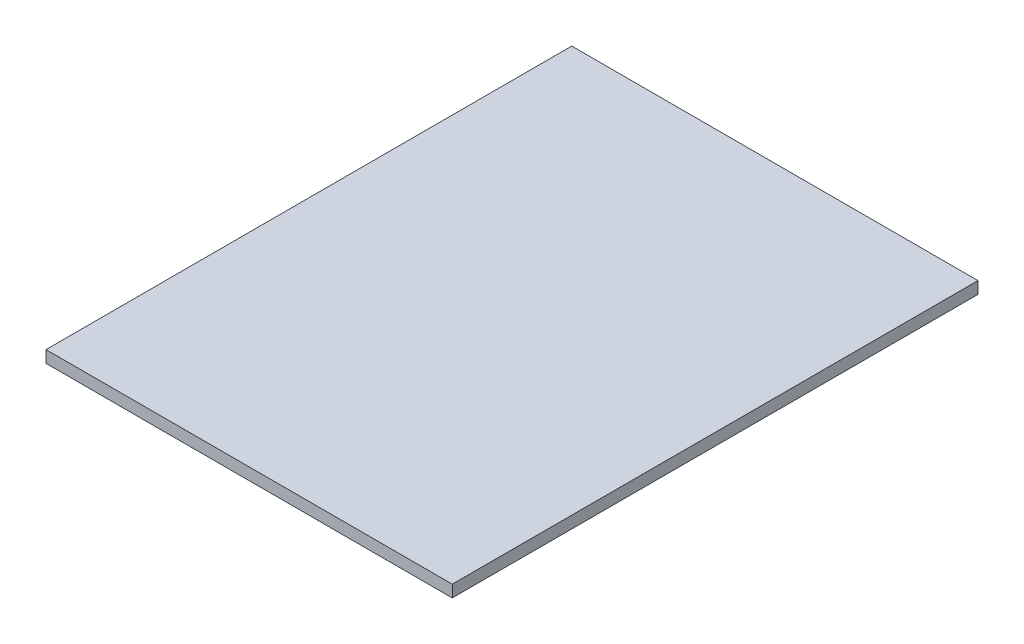
ISO-10303-21;
HEADER;
FILE_DESCRIPTION(('STEP AP214'),'2;1');
FILE_NAME('part.step','',(''),(''),'','','');
FILE_SCHEMA(('AUTOMOTIVE_DESIGN { 1 0 10303 214 1 1 1 1 }'));
ENDSEC;
DATA;
#1=APPLICATION_CONTEXT('core data for automotive mechanical design processes');
#2=APPLICATION_PROTOCOL_DEFINITION('international standard','automotive_design',2000,#1);
#3=PRODUCT_CONTEXT('',#1,'mechanical');
#4=PRODUCT('Part','Part','',(#3));
#5=PRODUCT_RELATED_PRODUCT_CATEGORY('part','',(#4));
#6=PRODUCT_DEFINITION_FORMATION('','',#4);
#7=PRODUCT_DEFINITION_CONTEXT('part definition',#1,'design');
#8=PRODUCT_DEFINITION('design','',#6,#7);
#9=PRODUCT_DEFINITION_SHAPE('','',#8);
#10=(LENGTH_UNIT() NAMED_UNIT(*) SI_UNIT(.MILLI.,.METRE.));
#11=(NAMED_UNIT(*) PLANE_ANGLE_UNIT() SI_UNIT($,.RADIAN.));
#12=(NAMED_UNIT(*) SI_UNIT($,.STERADIAN.) SOLID_ANGLE_UNIT());
#13=UNCERTAINTY_MEASURE_WITH_UNIT(LENGTH_MEASURE(1.E-05),#10,'distance_accuracy_value','');
#14=(GEOMETRIC_REPRESENTATION_CONTEXT(3) GLOBAL_UNCERTAINTY_ASSIGNED_CONTEXT((#13)) GLOBAL_UNIT_ASSIGNED_CONTEXT((#10,
#11,#12)) REPRESENTATION_CONTEXT('',''));
#15=CARTESIAN_POINT('',(0.,0.,0.));
#16=DIRECTION('',(0.,0.,1.));
#17=DIRECTION('',(1.,0.,0.));
#18=AXIS2_PLACEMENT_3D('',#15,#16,#17);
#19=CARTESIAN_POINT('',(107.95,3.175,-139.7));
#20=DIRECTION('',(-1.,0.,0.));
#21=DIRECTION('',(0.,0.,1.));
#22=AXIS2_PLACEMENT_3D('',#19,#20,#21);
#23=PLANE('',#22);
#24=DIRECTION('',(0.,0.,-1.));
#25=VECTOR('',#24,1.);
#26=CARTESIAN_POINT('',(107.95,-3.175,-139.7));
#27=LINE('',#26,#25);
#28=CARTESIAN_POINT('',(107.95,-3.175,139.7));
#29=VERTEX_POINT('',#28);
#30=CARTESIAN_POINT('',(107.95,-3.175,-139.7));
#31=VERTEX_POINT('',#30);
#32=EDGE_CURVE('E97',#29,#31,#27,.T.);
#33=ORIENTED_EDGE('',*,*,#32,.T.);
#34=DIRECTION('',(0.,-1.,0.));
#35=VECTOR('',#34,1.);
#36=CARTESIAN_POINT('',(107.95,3.175,-139.7));
#37=LINE('',#36,#35);
#38=CARTESIAN_POINT('',(107.95,3.175,-139.7));
#39=VERTEX_POINT('',#38);
#40=EDGE_CURVE('E11',#39,#31,#37,.T.);
#41=ORIENTED_EDGE('',*,*,#40,.F.);
#42=DIRECTION('',(0.,0.,-1.));
#43=VECTOR('',#42,1.);
#44=CARTESIAN_POINT('',(107.95,3.175,-139.7));
#45=LINE('',#44,#43);
#46=CARTESIAN_POINT('',(107.95,3.175,139.7));
#47=VERTEX_POINT('',#46);
#48=EDGE_CURVE('E85',#47,#39,#45,.T.);
#49=ORIENTED_EDGE('',*,*,#48,.F.);
#50=DIRECTION('',(0.,-1.,0.));
#51=VECTOR('',#50,1.);
#52=CARTESIAN_POINT('',(107.95,3.175,139.7));
#53=LINE('',#52,#51);
#54=EDGE_CURVE('E93',#47,#29,#53,.T.);
#55=ORIENTED_EDGE('',*,*,#54,.T.);
#56=EDGE_LOOP('',(#33,#41,#49,#55));
#57=FACE_BOUND('',#56,.T.);
#58=ADVANCED_FACE('F34',(#57),#23,.F.);
#59=CARTESIAN_POINT('',(-107.95,3.175,-139.7));
#60=DIRECTION('',(0.,0.,1.));
#61=DIRECTION('',(1.,0.,0.));
#62=AXIS2_PLACEMENT_3D('',#59,#60,#61);
#63=PLANE('',#62);
#64=DIRECTION('',(-1.,0.,0.));
#65=VECTOR('',#64,1.);
#66=CARTESIAN_POINT('',(-107.95,-3.175,-139.7));
#67=LINE('',#66,#65);
#68=CARTESIAN_POINT('',(-107.95,-3.175,-139.7));
#69=VERTEX_POINT('',#68);
#70=EDGE_CURVE('E89',#31,#69,#67,.T.);
#71=ORIENTED_EDGE('',*,*,#70,.T.);
#72=DIRECTION('',(0.,-1.,0.));
#73=VECTOR('',#72,1.);
#74=CARTESIAN_POINT('',(-107.95,3.175,-139.7));
#75=LINE('',#74,#73);
#76=CARTESIAN_POINT('',(-107.95,3.175,-139.7));
#77=VERTEX_POINT('',#76);
#78=EDGE_CURVE('E42',#77,#69,#75,.T.);
#79=ORIENTED_EDGE('',*,*,#78,.F.);
#80=DIRECTION('',(-1.,0.,0.));
#81=VECTOR('',#80,1.);
#82=CARTESIAN_POINT('',(-107.95,3.175,-139.7));
#83=LINE('',#82,#81);
#84=EDGE_CURVE('E80',#39,#77,#83,.T.);
#85=ORIENTED_EDGE('',*,*,#84,.F.);
#86=ORIENTED_EDGE('',*,*,#40,.T.);
#87=EDGE_LOOP('',(#71,#79,#85,#86));
#88=FACE_BOUND('',#87,.T.);
#89=ADVANCED_FACE('F88',(#88),#63,.F.);
#90=CARTESIAN_POINT('',(-107.95,3.175,-139.7));
#91=DIRECTION('',(1.,0.,0.));
#92=DIRECTION('',(0.,0.,-1.));
#93=AXIS2_PLACEMENT_3D('',#90,#91,#92);
#94=PLANE('',#93);
#95=DIRECTION('',(0.,0.,1.));
#96=VECTOR('',#95,1.);
#97=CARTESIAN_POINT('',(-107.95,-3.175,-139.7));
#98=LINE('',#97,#96);
#99=CARTESIAN_POINT('',(-107.95,-3.175,139.7));
#100=VERTEX_POINT('',#99);
#101=EDGE_CURVE('E67',#69,#100,#98,.T.);
#102=ORIENTED_EDGE('',*,*,#101,.T.);
#103=DIRECTION('',(0.,-1.,0.));
#104=VECTOR('',#103,1.);
#105=CARTESIAN_POINT('',(-107.95,3.175,139.7));
#106=LINE('',#105,#104);
#107=CARTESIAN_POINT('',(-107.95,3.175,139.7));
#108=VERTEX_POINT('',#107);
#109=EDGE_CURVE('E90',#108,#100,#106,.T.);
#110=ORIENTED_EDGE('',*,*,#109,.F.);
#111=DIRECTION('',(0.,0.,1.));
#112=VECTOR('',#111,1.);
#113=CARTESIAN_POINT('',(-107.95,3.175,-139.7));
#114=LINE('',#113,#112);
#115=EDGE_CURVE('E83',#77,#108,#114,.T.);
#116=ORIENTED_EDGE('',*,*,#115,.F.);
#117=ORIENTED_EDGE('',*,*,#78,.T.);
#118=EDGE_LOOP('',(#102,#110,#116,#117));
#119=FACE_BOUND('',#118,.T.);
#120=ADVANCED_FACE('F91',(#119),#94,.F.);
#121=CARTESIAN_POINT('',(-107.95,3.175,139.7));
#122=DIRECTION('',(0.,0.,-1.));
#123=DIRECTION('',(-1.,0.,0.));
#124=AXIS2_PLACEMENT_3D('',#121,#122,#123);
#125=PLANE('',#124);
#126=DIRECTION('',(1.,0.,0.));
#127=VECTOR('',#126,1.);
#128=CARTESIAN_POINT('',(-107.95,-3.175,139.7));
#129=LINE('',#128,#127);
#130=EDGE_CURVE('E73',#100,#29,#129,.T.);
#131=ORIENTED_EDGE('',*,*,#130,.T.);
#132=ORIENTED_EDGE('',*,*,#54,.F.);
#133=DIRECTION('',(1.,0.,0.));
#134=VECTOR('',#133,1.);
#135=CARTESIAN_POINT('',(-107.95,3.175,139.7));
#136=LINE('',#135,#134);
#137=EDGE_CURVE('E50',#108,#47,#136,.T.);
#138=ORIENTED_EDGE('',*,*,#137,.F.);
#139=ORIENTED_EDGE('',*,*,#109,.T.);
#140=EDGE_LOOP('',(#131,#132,#138,#139));
#141=FACE_BOUND('',#140,.T.);
#142=ADVANCED_FACE('F104',(#141),#125,.F.);
#143=CARTESIAN_POINT('',(0.,3.175,0.));
#144=DIRECTION('',(0.,1.,0.));
#145=DIRECTION('',(0.,0.,1.));
#146=AXIS2_PLACEMENT_3D('',#143,#144,#145);
#147=PLANE('',#146);
#148=ORIENTED_EDGE('',*,*,#48,.T.);
#149=ORIENTED_EDGE('',*,*,#84,.T.);
#150=ORIENTED_EDGE('',*,*,#115,.T.);
#151=ORIENTED_EDGE('',*,*,#137,.T.);
#152=EDGE_LOOP('',(#148,#149,#150,#151));
#153=FACE_BOUND('',#152,.T.);
#154=ADVANCED_FACE('F81',(#153),#147,.T.);
#155=CARTESIAN_POINT('',(0.,-3.175,0.));
#156=DIRECTION('',(0.,1.,0.));
#157=DIRECTION('',(0.,0.,1.));
#158=AXIS2_PLACEMENT_3D('',#155,#156,#157);
#159=PLANE('',#158);
#160=ORIENTED_EDGE('',*,*,#32,.F.);
#161=ORIENTED_EDGE('',*,*,#130,.F.);
#162=ORIENTED_EDGE('',*,*,#101,.F.);
#163=ORIENTED_EDGE('',*,*,#70,.F.);
#164=EDGE_LOOP('',(#160,#161,#162,#163));
#165=FACE_BOUND('',#164,.T.);
#166=ADVANCED_FACE('F107',(#165),#159,.F.);
#167=CLOSED_SHELL('',(#58,#89,#120,#142,#154,#166));
#168=MANIFOLD_SOLID_BREP('B2',#167);
#169=ADVANCED_BREP_SHAPE_REPRESENTATION('',(#18,#168),#14);
#170=SHAPE_DEFINITION_REPRESENTATION(#9,#169);
ENDSEC;
END-ISO-10303-21;
